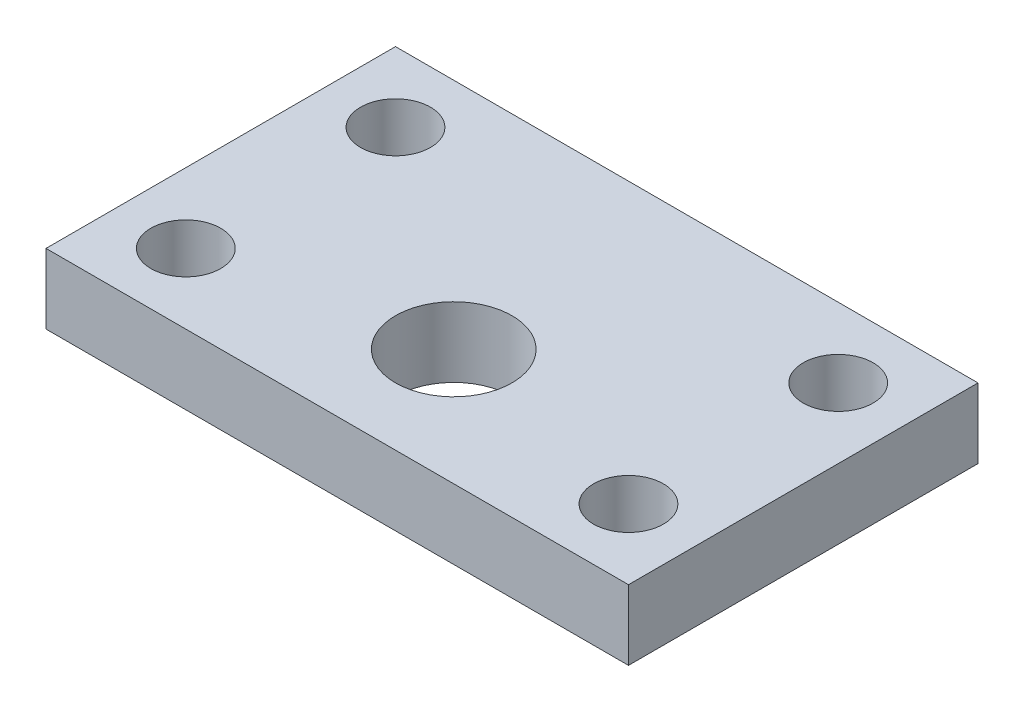
ISO-10303-21;
HEADER;
FILE_DESCRIPTION(('STEP AP214'),'2;1');
FILE_NAME('part.step','',(''),(''),'','','');
FILE_SCHEMA(('AUTOMOTIVE_DESIGN { 1 0 10303 214 1 1 1 1 }'));
ENDSEC;
DATA;
#1=APPLICATION_CONTEXT('core data for automotive mechanical design processes');
#2=APPLICATION_PROTOCOL_DEFINITION('international standard','automotive_design',2000,#1);
#3=PRODUCT_CONTEXT('',#1,'mechanical');
#4=PRODUCT('Part','Part','',(#3));
#5=PRODUCT_RELATED_PRODUCT_CATEGORY('part','',(#4));
#6=PRODUCT_DEFINITION_FORMATION('','',#4);
#7=PRODUCT_DEFINITION_CONTEXT('part definition',#1,'design');
#8=PRODUCT_DEFINITION('design','',#6,#7);
#9=PRODUCT_DEFINITION_SHAPE('','',#8);
#10=(LENGTH_UNIT() NAMED_UNIT(*) SI_UNIT(.MILLI.,.METRE.));
#11=(NAMED_UNIT(*) PLANE_ANGLE_UNIT() SI_UNIT($,.RADIAN.));
#12=(NAMED_UNIT(*) SI_UNIT($,.STERADIAN.) SOLID_ANGLE_UNIT());
#13=UNCERTAINTY_MEASURE_WITH_UNIT(LENGTH_MEASURE(1.E-05),#10,'distance_accuracy_value','');
#14=(GEOMETRIC_REPRESENTATION_CONTEXT(3) GLOBAL_UNCERTAINTY_ASSIGNED_CONTEXT((#13)) GLOBAL_UNIT_ASSIGNED_CONTEXT((#10,
#11,#12)) REPRESENTATION_CONTEXT('',''));
#15=CARTESIAN_POINT('',(0.,0.,0.));
#16=DIRECTION('',(0.,0.,1.));
#17=DIRECTION('',(1.,0.,0.));
#18=AXIS2_PLACEMENT_3D('',#15,#16,#17);
#19=CARTESIAN_POINT('',(125.,15.,-75.));
#20=DIRECTION('',(-1.,0.,0.));
#21=DIRECTION('',(0.,0.,1.));
#22=AXIS2_PLACEMENT_3D('',#19,#20,#21);
#23=PLANE('',#22);
#24=DIRECTION('',(0.,0.,-1.));
#25=VECTOR('',#24,1.);
#26=CARTESIAN_POINT('',(125.,-15.,-75.));
#27=LINE('',#26,#25);
#28=CARTESIAN_POINT('',(125.,-15.,75.));
#29=VERTEX_POINT('',#28);
#30=CARTESIAN_POINT('',(125.,-15.,-75.));
#31=VERTEX_POINT('',#30);
#32=EDGE_CURVE('E102',#29,#31,#27,.T.);
#33=ORIENTED_EDGE('',*,*,#32,.T.);
#34=DIRECTION('',(0.,-1.,0.));
#35=VECTOR('',#34,1.);
#36=CARTESIAN_POINT('',(125.,15.,-75.));
#37=LINE('',#36,#35);
#38=CARTESIAN_POINT('',(125.,15.,-75.));
#39=VERTEX_POINT('',#38);
#40=EDGE_CURVE('E11',#39,#31,#37,.T.);
#41=ORIENTED_EDGE('',*,*,#40,.F.);
#42=DIRECTION('',(0.,0.,-1.));
#43=VECTOR('',#42,1.);
#44=CARTESIAN_POINT('',(125.,15.,-75.));
#45=LINE('',#44,#43);
#46=CARTESIAN_POINT('',(125.,15.,75.));
#47=VERTEX_POINT('',#46);
#48=EDGE_CURVE('E90',#47,#39,#45,.T.);
#49=ORIENTED_EDGE('',*,*,#48,.F.);
#50=DIRECTION('',(0.,-1.,0.));
#51=VECTOR('',#50,1.);
#52=CARTESIAN_POINT('',(125.,15.,75.));
#53=LINE('',#52,#51);
#54=EDGE_CURVE('E98',#47,#29,#53,.T.);
#55=ORIENTED_EDGE('',*,*,#54,.T.);
#56=EDGE_LOOP('',(#33,#41,#49,#55));
#57=FACE_BOUND('',#56,.T.);
#58=ADVANCED_FACE('F39',(#57),#23,.F.);
#59=CARTESIAN_POINT('',(-125.,15.,-75.));
#60=DIRECTION('',(0.,0.,1.));
#61=DIRECTION('',(1.,0.,0.));
#62=AXIS2_PLACEMENT_3D('',#59,#60,#61);
#63=PLANE('',#62);
#64=DIRECTION('',(-1.,0.,0.));
#65=VECTOR('',#64,1.);
#66=CARTESIAN_POINT('',(-125.,-15.,-75.));
#67=LINE('',#66,#65);
#68=CARTESIAN_POINT('',(-125.,-15.,-75.));
#69=VERTEX_POINT('',#68);
#70=EDGE_CURVE('E94',#31,#69,#67,.T.);
#71=ORIENTED_EDGE('',*,*,#70,.T.);
#72=DIRECTION('',(0.,-1.,0.));
#73=VECTOR('',#72,1.);
#74=CARTESIAN_POINT('',(-125.,15.,-75.));
#75=LINE('',#74,#73);
#76=CARTESIAN_POINT('',(-125.,15.,-75.));
#77=VERTEX_POINT('',#76);
#78=EDGE_CURVE('E47',#77,#69,#75,.T.);
#79=ORIENTED_EDGE('',*,*,#78,.F.);
#80=DIRECTION('',(-1.,0.,0.));
#81=VECTOR('',#80,1.);
#82=CARTESIAN_POINT('',(-125.,15.,-75.));
#83=LINE('',#82,#81);
#84=EDGE_CURVE('E85',#39,#77,#83,.T.);
#85=ORIENTED_EDGE('',*,*,#84,.F.);
#86=ORIENTED_EDGE('',*,*,#40,.T.);
#87=EDGE_LOOP('',(#71,#79,#85,#86));
#88=FACE_BOUND('',#87,.T.);
#89=ADVANCED_FACE('F93',(#88),#63,.F.);
#90=CARTESIAN_POINT('',(-125.,15.,-75.));
#91=DIRECTION('',(1.,0.,0.));
#92=DIRECTION('',(0.,0.,-1.));
#93=AXIS2_PLACEMENT_3D('',#90,#91,#92);
#94=PLANE('',#93);
#95=DIRECTION('',(0.,0.,1.));
#96=VECTOR('',#95,1.);
#97=CARTESIAN_POINT('',(-125.,-15.,-75.));
#98=LINE('',#97,#96);
#99=CARTESIAN_POINT('',(-125.,-15.,75.));
#100=VERTEX_POINT('',#99);
#101=EDGE_CURVE('E72',#69,#100,#98,.T.);
#102=ORIENTED_EDGE('',*,*,#101,.T.);
#103=DIRECTION('',(0.,-1.,0.));
#104=VECTOR('',#103,1.);
#105=CARTESIAN_POINT('',(-125.,15.,75.));
#106=LINE('',#105,#104);
#107=CARTESIAN_POINT('',(-125.,15.,75.));
#108=VERTEX_POINT('',#107);
#109=EDGE_CURVE('E95',#108,#100,#106,.T.);
#110=ORIENTED_EDGE('',*,*,#109,.F.);
#111=DIRECTION('',(0.,0.,1.));
#112=VECTOR('',#111,1.);
#113=CARTESIAN_POINT('',(-125.,15.,-75.));
#114=LINE('',#113,#112);
#115=EDGE_CURVE('E88',#77,#108,#114,.T.);
#116=ORIENTED_EDGE('',*,*,#115,.F.);
#117=ORIENTED_EDGE('',*,*,#78,.T.);
#118=EDGE_LOOP('',(#102,#110,#116,#117));
#119=FACE_BOUND('',#118,.T.);
#120=ADVANCED_FACE('F96',(#119),#94,.F.);
#121=CARTESIAN_POINT('',(-125.,15.,75.));
#122=DIRECTION('',(0.,0.,-1.));
#123=DIRECTION('',(-1.,0.,0.));
#124=AXIS2_PLACEMENT_3D('',#121,#122,#123);
#125=PLANE('',#124);
#126=DIRECTION('',(1.,0.,0.));
#127=VECTOR('',#126,1.);
#128=CARTESIAN_POINT('',(-125.,-15.,75.));
#129=LINE('',#128,#127);
#130=EDGE_CURVE('E78',#100,#29,#129,.T.);
#131=ORIENTED_EDGE('',*,*,#130,.T.);
#132=ORIENTED_EDGE('',*,*,#54,.F.);
#133=DIRECTION('',(1.,0.,0.));
#134=VECTOR('',#133,1.);
#135=CARTESIAN_POINT('',(-125.,15.,75.));
#136=LINE('',#135,#134);
#137=EDGE_CURVE('E55',#108,#47,#136,.T.);
#138=ORIENTED_EDGE('',*,*,#137,.F.);
#139=ORIENTED_EDGE('',*,*,#109,.T.);
#140=EDGE_LOOP('',(#131,#132,#138,#139));
#141=FACE_BOUND('',#140,.T.);
#142=ADVANCED_FACE('F110',(#141),#125,.F.);
#143=CARTESIAN_POINT('',(0.,15.,0.));
#144=DIRECTION('',(0.,1.,0.));
#145=DIRECTION('',(0.,0.,1.));
#146=AXIS2_PLACEMENT_3D('',#143,#144,#145);
#147=PLANE('',#146);
#148=CARTESIAN_POINT('',(-95.,15.,-45.));
#149=DIRECTION('',(0.,1.,0.));
#150=DIRECTION('',(0.,0.,1.));
#151=AXIS2_PLACEMENT_3D('',#148,#149,#150);
#152=CIRCLE('',#151,15.);
#153=CARTESIAN_POINT('',(-95.,15.,-30.));
#154=VERTEX_POINT('',#153);
#155=EDGE_CURVE('E131',#154,#154,#152,.T.);
#156=ORIENTED_EDGE('',*,*,#155,.F.);
#157=EDGE_LOOP('',(#156));
#158=FACE_BOUND('',#157,.T.);
#159=CARTESIAN_POINT('',(95.,15.,-45.));
#160=DIRECTION('',(0.,1.,0.));
#161=DIRECTION('',(0.,0.,1.));
#162=AXIS2_PLACEMENT_3D('',#159,#160,#161);
#163=CIRCLE('',#162,15.);
#164=CARTESIAN_POINT('',(95.,15.,-30.));
#165=VERTEX_POINT('',#164);
#166=EDGE_CURVE('E137',#165,#165,#163,.T.);
#167=ORIENTED_EDGE('',*,*,#166,.F.);
#168=EDGE_LOOP('',(#167));
#169=FACE_BOUND('',#168,.T.);
#170=CARTESIAN_POINT('',(95.,15.,45.));
#171=DIRECTION('',(0.,1.,0.));
#172=DIRECTION('',(0.,0.,1.));
#173=AXIS2_PLACEMENT_3D('',#170,#171,#172);
#174=CIRCLE('',#173,15.);
#175=CARTESIAN_POINT('',(95.,15.,60.));
#176=VERTEX_POINT('',#175);
#177=EDGE_CURVE('E125',#176,#176,#174,.T.);
#178=ORIENTED_EDGE('',*,*,#177,.F.);
#179=EDGE_LOOP('',(#178));
#180=FACE_BOUND('',#179,.T.);
#181=CARTESIAN_POINT('',(-95.,15.,45.));
#182=DIRECTION('',(0.,1.,0.));
#183=DIRECTION('',(0.,0.,1.));
#184=AXIS2_PLACEMENT_3D('',#181,#182,#183);
#185=CIRCLE('',#184,15.);
#186=CARTESIAN_POINT('',(-95.,15.,60.));
#187=VERTEX_POINT('',#186);
#188=EDGE_CURVE('E122',#187,#187,#185,.T.);
#189=ORIENTED_EDGE('',*,*,#188,.F.);
#190=EDGE_LOOP('',(#189));
#191=FACE_BOUND('',#190,.T.);
#192=CARTESIAN_POINT('',(0.,15.,25.));
#193=DIRECTION('',(0.,1.,0.));
#194=DIRECTION('',(0.,0.,1.));
#195=AXIS2_PLACEMENT_3D('',#192,#193,#194);
#196=CIRCLE('',#195,25.);
#197=CARTESIAN_POINT('',(0.,15.,50.));
#198=VERTEX_POINT('',#197);
#199=EDGE_CURVE('E116',#198,#198,#196,.T.);
#200=ORIENTED_EDGE('',*,*,#199,.F.);
#201=EDGE_LOOP('',(#200));
#202=FACE_BOUND('',#201,.T.);
#203=ORIENTED_EDGE('',*,*,#48,.T.);
#204=ORIENTED_EDGE('',*,*,#84,.T.);
#205=ORIENTED_EDGE('',*,*,#115,.T.);
#206=ORIENTED_EDGE('',*,*,#137,.T.);
#207=EDGE_LOOP('',(#203,#204,#205,#206));
#208=FACE_BOUND('',#207,.T.);
#209=ADVANCED_FACE('F86',(#158,#169,#180,#191,#202,#208),#147,.T.);
#210=CARTESIAN_POINT('',(0.,-15.,0.));
#211=DIRECTION('',(0.,1.,0.));
#212=DIRECTION('',(0.,0.,1.));
#213=AXIS2_PLACEMENT_3D('',#210,#211,#212);
#214=PLANE('',#213);
#215=CARTESIAN_POINT('',(-95.,-15.,-45.));
#216=DIRECTION('',(0.,1.,0.));
#217=DIRECTION('',(0.,0.,1.));
#218=AXIS2_PLACEMENT_3D('',#215,#216,#217);
#219=CIRCLE('',#218,15.);
#220=CARTESIAN_POINT('',(-95.,-15.,-30.));
#221=VERTEX_POINT('',#220);
#222=EDGE_CURVE('E128',#221,#221,#219,.T.);
#223=ORIENTED_EDGE('',*,*,#222,.T.);
#224=EDGE_LOOP('',(#223));
#225=FACE_BOUND('',#224,.T.);
#226=CARTESIAN_POINT('',(95.,-15.,-45.));
#227=DIRECTION('',(0.,1.,0.));
#228=DIRECTION('',(0.,0.,1.));
#229=AXIS2_PLACEMENT_3D('',#226,#227,#228);
#230=CIRCLE('',#229,15.);
#231=CARTESIAN_POINT('',(95.,-15.,-30.));
#232=VERTEX_POINT('',#231);
#233=EDGE_CURVE('E134',#232,#232,#230,.T.);
#234=ORIENTED_EDGE('',*,*,#233,.T.);
#235=EDGE_LOOP('',(#234));
#236=FACE_BOUND('',#235,.T.);
#237=CARTESIAN_POINT('',(95.,-15.,45.));
#238=DIRECTION('',(0.,1.,0.));
#239=DIRECTION('',(0.,0.,1.));
#240=AXIS2_PLACEMENT_3D('',#237,#238,#239);
#241=CIRCLE('',#240,15.);
#242=CARTESIAN_POINT('',(95.,-15.,60.));
#243=VERTEX_POINT('',#242);
#244=EDGE_CURVE('E140',#243,#243,#241,.T.);
#245=ORIENTED_EDGE('',*,*,#244,.T.);
#246=EDGE_LOOP('',(#245));
#247=FACE_BOUND('',#246,.T.);
#248=CARTESIAN_POINT('',(-95.,-15.,45.));
#249=DIRECTION('',(0.,1.,0.));
#250=DIRECTION('',(0.,0.,1.));
#251=AXIS2_PLACEMENT_3D('',#248,#249,#250);
#252=CIRCLE('',#251,15.);
#253=CARTESIAN_POINT('',(-95.,-15.,60.));
#254=VERTEX_POINT('',#253);
#255=EDGE_CURVE('E119',#254,#254,#252,.T.);
#256=ORIENTED_EDGE('',*,*,#255,.T.);
#257=EDGE_LOOP('',(#256));
#258=FACE_BOUND('',#257,.T.);
#259=CARTESIAN_POINT('',(0.,-15.,25.));
#260=DIRECTION('',(0.,1.,0.));
#261=DIRECTION('',(0.,0.,1.));
#262=AXIS2_PLACEMENT_3D('',#259,#260,#261);
#263=CIRCLE('',#262,25.);
#264=CARTESIAN_POINT('',(0.,-15.,50.));
#265=VERTEX_POINT('',#264);
#266=EDGE_CURVE('E105',#265,#265,#263,.T.);
#267=ORIENTED_EDGE('',*,*,#266,.T.);
#268=EDGE_LOOP('',(#267));
#269=FACE_BOUND('',#268,.T.);
#270=ORIENTED_EDGE('',*,*,#32,.F.);
#271=ORIENTED_EDGE('',*,*,#130,.F.);
#272=ORIENTED_EDGE('',*,*,#101,.F.);
#273=ORIENTED_EDGE('',*,*,#70,.F.);
#274=EDGE_LOOP('',(#270,#271,#272,#273));
#275=FACE_BOUND('',#274,.T.);
#276=ADVANCED_FACE('F113',(#225,#236,#247,#258,#269,#275),#214,.F.);
#277=CARTESIAN_POINT('',(0.,-15.,25.));
#278=DIRECTION('',(0.,1.,0.));
#279=DIRECTION('',(0.,0.,1.));
#280=AXIS2_PLACEMENT_3D('',#277,#278,#279);
#281=CYLINDRICAL_SURFACE('',#280,25.);
#282=ORIENTED_EDGE('',*,*,#266,.F.);
#283=EDGE_LOOP('',(#282));
#284=FACE_BOUND('',#283,.T.);
#285=ORIENTED_EDGE('',*,*,#199,.T.);
#286=EDGE_LOOP('',(#285));
#287=FACE_BOUND('',#286,.T.);
#288=ADVANCED_FACE('F156',(#284,#287),#281,.F.);
#289=CARTESIAN_POINT('',(-95.,-15.,45.));
#290=DIRECTION('',(0.,1.,0.));
#291=DIRECTION('',(0.,0.,1.));
#292=AXIS2_PLACEMENT_3D('',#289,#290,#291);
#293=CYLINDRICAL_SURFACE('',#292,15.);
#294=ORIENTED_EDGE('',*,*,#255,.F.);
#295=EDGE_LOOP('',(#294));
#296=FACE_BOUND('',#295,.T.);
#297=ORIENTED_EDGE('',*,*,#188,.T.);
#298=EDGE_LOOP('',(#297));
#299=FACE_BOUND('',#298,.T.);
#300=ADVANCED_FACE('F158',(#296,#299),#293,.F.);
#301=CARTESIAN_POINT('',(95.,-15.,45.));
#302=DIRECTION('',(0.,1.,0.));
#303=DIRECTION('',(0.,0.,1.));
#304=AXIS2_PLACEMENT_3D('',#301,#302,#303);
#305=CYLINDRICAL_SURFACE('',#304,15.);
#306=ORIENTED_EDGE('',*,*,#244,.F.);
#307=EDGE_LOOP('',(#306));
#308=FACE_BOUND('',#307,.T.);
#309=ORIENTED_EDGE('',*,*,#177,.T.);
#310=EDGE_LOOP('',(#309));
#311=FACE_BOUND('',#310,.T.);
#312=ADVANCED_FACE('F146',(#308,#311),#305,.F.);
#313=CARTESIAN_POINT('',(95.,-15.,-45.));
#314=DIRECTION('',(0.,1.,0.));
#315=DIRECTION('',(0.,0.,1.));
#316=AXIS2_PLACEMENT_3D('',#313,#314,#315);
#317=CYLINDRICAL_SURFACE('',#316,15.);
#318=ORIENTED_EDGE('',*,*,#233,.F.);
#319=EDGE_LOOP('',(#318));
#320=FACE_BOUND('',#319,.T.);
#321=ORIENTED_EDGE('',*,*,#166,.T.);
#322=EDGE_LOOP('',(#321));
#323=FACE_BOUND('',#322,.T.);
#324=ADVANCED_FACE('F224',(#320,#323),#317,.F.);
#325=CARTESIAN_POINT('',(-95.,-15.,-45.));
#326=DIRECTION('',(0.,1.,0.));
#327=DIRECTION('',(0.,0.,1.));
#328=AXIS2_PLACEMENT_3D('',#325,#326,#327);
#329=CYLINDRICAL_SURFACE('',#328,15.);
#330=ORIENTED_EDGE('',*,*,#222,.F.);
#331=EDGE_LOOP('',(#330));
#332=FACE_BOUND('',#331,.T.);
#333=ORIENTED_EDGE('',*,*,#155,.T.);
#334=EDGE_LOOP('',(#333));
#335=FACE_BOUND('',#334,.T.);
#336=ADVANCED_FACE('F233',(#332,#335),#329,.F.);
#337=CLOSED_SHELL('',(#58,#89,#120,#142,#209,#276,#288,#300,#312,#324,#336));
#338=MANIFOLD_SOLID_BREP('B2',#337);
#339=ADVANCED_BREP_SHAPE_REPRESENTATION('',(#18,#338),#14);
#340=SHAPE_DEFINITION_REPRESENTATION(#9,#339);
ENDSEC;
END-ISO-10303-21;
